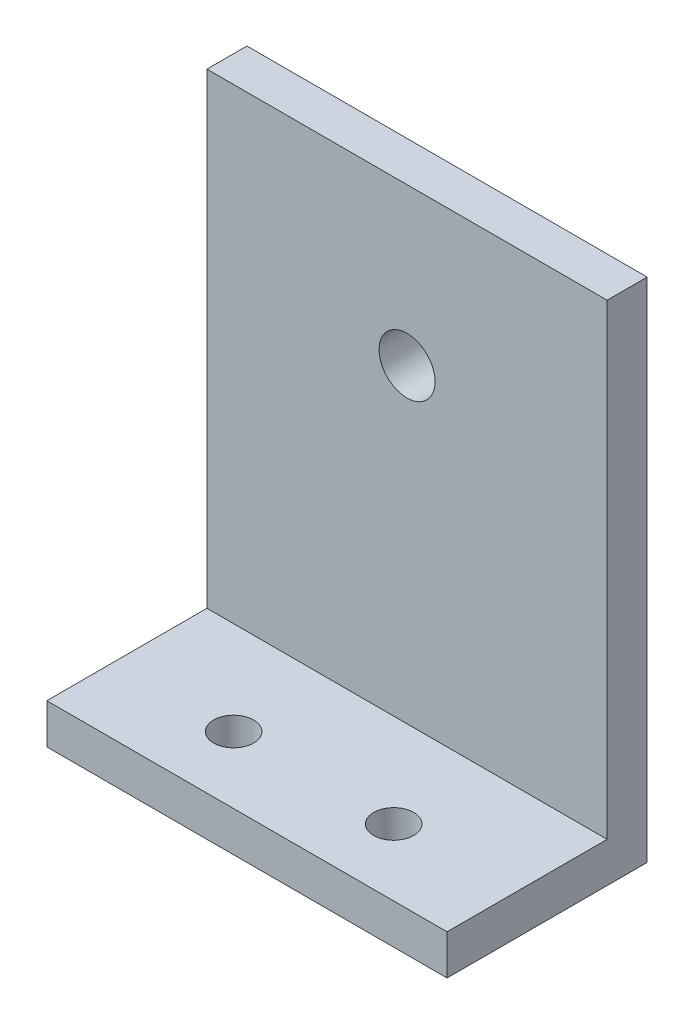
ISO-10303-21;
HEADER;
FILE_DESCRIPTION(('STEP AP214'),'2;1');
FILE_NAME('part.step','',(''),(''),'','','');
FILE_SCHEMA(('AUTOMOTIVE_DESIGN { 1 0 10303 214 1 1 1 1 }'));
ENDSEC;
DATA;
#1=APPLICATION_CONTEXT('core data for automotive mechanical design processes');
#2=APPLICATION_PROTOCOL_DEFINITION('international standard','automotive_design',2000,#1);
#3=PRODUCT_CONTEXT('',#1,'mechanical');
#4=PRODUCT('Part','Part','',(#3));
#5=PRODUCT_RELATED_PRODUCT_CATEGORY('part','',(#4));
#6=PRODUCT_DEFINITION_FORMATION('','',#4);
#7=PRODUCT_DEFINITION_CONTEXT('part definition',#1,'design');
#8=PRODUCT_DEFINITION('design','',#6,#7);
#9=PRODUCT_DEFINITION_SHAPE('','',#8);
#10=(LENGTH_UNIT() NAMED_UNIT(*) SI_UNIT(.MILLI.,.METRE.));
#11=(NAMED_UNIT(*) PLANE_ANGLE_UNIT() SI_UNIT($,.RADIAN.));
#12=(NAMED_UNIT(*) SI_UNIT($,.STERADIAN.) SOLID_ANGLE_UNIT());
#13=UNCERTAINTY_MEASURE_WITH_UNIT(LENGTH_MEASURE(1.E-05),#10,'distance_accuracy_value','');
#14=(GEOMETRIC_REPRESENTATION_CONTEXT(3) GLOBAL_UNCERTAINTY_ASSIGNED_CONTEXT((#13)) GLOBAL_UNIT_ASSIGNED_CONTEXT((#10,
#11,#12)) REPRESENTATION_CONTEXT('',''));
#15=CARTESIAN_POINT('',(0.,0.,0.));
#16=DIRECTION('',(0.,0.,1.));
#17=DIRECTION('',(1.,0.,0.));
#18=AXIS2_PLACEMENT_3D('',#15,#16,#17);
#19=CARTESIAN_POINT('',(30.,0.,0.));
#20=DIRECTION('',(0.,-1.,0.));
#21=DIRECTION('',(0.,0.,-1.));
#22=AXIS2_PLACEMENT_3D('',#19,#20,#21);
#23=PLANE('',#22);
#24=CARTESIAN_POINT('',(8.99999999999999,0.,7.));
#25=DIRECTION('',(0.,1.,0.));
#26=DIRECTION('',(0.,0.,1.));
#27=AXIS2_PLACEMENT_3D('',#24,#25,#26);
#28=CIRCLE('',#27,1.5);
#29=CARTESIAN_POINT('',(8.99999999999999,0.,8.5));
#30=VERTEX_POINT('',#29);
#31=EDGE_CURVE('E146',#30,#30,#28,.T.);
#32=ORIENTED_EDGE('',*,*,#31,.F.);
#33=EDGE_LOOP('',(#32));
#34=FACE_BOUND('',#33,.T.);
#35=CARTESIAN_POINT('',(21.,0.,7.));
#36=DIRECTION('',(0.,1.,0.));
#37=DIRECTION('',(0.,0.,-1.));
#38=AXIS2_PLACEMENT_3D('',#35,#36,#37);
#39=CIRCLE('',#38,1.5);
#40=CARTESIAN_POINT('',(21.,0.,5.5));
#41=VERTEX_POINT('',#40);
#42=EDGE_CURVE('E152',#41,#41,#39,.T.);
#43=ORIENTED_EDGE('',*,*,#42,.F.);
#44=EDGE_LOOP('',(#43));
#45=FACE_BOUND('',#44,.T.);
#46=DIRECTION('',(-1.,0.,0.));
#47=VECTOR('',#46,1.);
#48=CARTESIAN_POINT('',(30.,0.,12.));
#49=LINE('',#48,#47);
#50=CARTESIAN_POINT('',(30.,0.,12.));
#51=VERTEX_POINT('',#50);
#52=CARTESIAN_POINT('',(0.,0.,12.));
#53=VERTEX_POINT('',#52);
#54=EDGE_CURVE('E49',#51,#53,#49,.T.);
#55=ORIENTED_EDGE('',*,*,#54,.F.);
#56=DIRECTION('',(0.,0.,1.));
#57=VECTOR('',#56,1.);
#58=CARTESIAN_POINT('',(30.,0.,0.));
#59=LINE('',#58,#57);
#60=CARTESIAN_POINT('',(30.,0.,0.));
#61=VERTEX_POINT('',#60);
#62=EDGE_CURVE('E122',#61,#51,#59,.T.);
#63=ORIENTED_EDGE('',*,*,#62,.F.);
#64=DIRECTION('',(-1.,0.,0.));
#65=VECTOR('',#64,1.);
#66=CARTESIAN_POINT('',(30.,0.,0.));
#67=LINE('',#66,#65);
#68=CARTESIAN_POINT('',(0.,0.,0.));
#69=VERTEX_POINT('',#68);
#70=EDGE_CURVE('E123',#61,#69,#67,.T.);
#71=ORIENTED_EDGE('',*,*,#70,.T.);
#72=DIRECTION('',(0.,0.,1.));
#73=VECTOR('',#72,1.);
#74=CARTESIAN_POINT('',(0.,0.,0.));
#75=LINE('',#74,#73);
#76=EDGE_CURVE('E112',#69,#53,#75,.T.);
#77=ORIENTED_EDGE('',*,*,#76,.T.);
#78=EDGE_LOOP('',(#55,#63,#71,#77));
#79=FACE_BOUND('',#78,.T.);
#80=ADVANCED_FACE('F35',(#34,#45,#79),#23,.F.);
#81=CARTESIAN_POINT('',(30.,-3.,35.));
#82=DIRECTION('',(0.,1.,0.));
#83=DIRECTION('',(0.,0.,1.));
#84=AXIS2_PLACEMENT_3D('',#81,#82,#83);
#85=PLANE('',#84);
#86=CARTESIAN_POINT('',(8.99999999999999,-3.,7.));
#87=DIRECTION('',(0.,1.,0.));
#88=DIRECTION('',(0.,0.,1.));
#89=AXIS2_PLACEMENT_3D('',#86,#87,#88);
#90=CIRCLE('',#89,1.5);
#91=CARTESIAN_POINT('',(8.99999999999999,-3.,8.5));
#92=VERTEX_POINT('',#91);
#93=EDGE_CURVE('E116',#92,#92,#90,.F.);
#94=ORIENTED_EDGE('',*,*,#93,.F.);
#95=EDGE_LOOP('',(#94));
#96=FACE_BOUND('',#95,.T.);
#97=CARTESIAN_POINT('',(21.,-3.,7.));
#98=DIRECTION('',(0.,1.,0.));
#99=DIRECTION('',(0.,0.,1.));
#100=AXIS2_PLACEMENT_3D('',#97,#98,#99);
#101=CIRCLE('',#100,1.5);
#102=CARTESIAN_POINT('',(21.,-3.,8.5));
#103=VERTEX_POINT('',#102);
#104=EDGE_CURVE('E149',#103,#103,#101,.F.);
#105=ORIENTED_EDGE('',*,*,#104,.F.);
#106=EDGE_LOOP('',(#105));
#107=FACE_BOUND('',#106,.T.);
#108=DIRECTION('',(1.,0.,0.));
#109=VECTOR('',#108,1.);
#110=CARTESIAN_POINT('',(0.,-3.,12.));
#111=LINE('',#110,#109);
#112=CARTESIAN_POINT('',(0.,-3.,12.));
#113=VERTEX_POINT('',#112);
#114=CARTESIAN_POINT('',(30.,-3.,12.));
#115=VERTEX_POINT('',#114);
#116=EDGE_CURVE('E97',#113,#115,#111,.T.);
#117=ORIENTED_EDGE('',*,*,#116,.F.);
#118=DIRECTION('',(0.,0.,-1.));
#119=VECTOR('',#118,1.);
#120=CARTESIAN_POINT('',(0.,-3.,35.));
#121=LINE('',#120,#119);
#122=CARTESIAN_POINT('',(0.,-3.,-3.));
#123=VERTEX_POINT('',#122);
#124=EDGE_CURVE('E105',#113,#123,#121,.T.);
#125=ORIENTED_EDGE('',*,*,#124,.T.);
#126=DIRECTION('',(-1.,0.,0.));
#127=VECTOR('',#126,1.);
#128=CARTESIAN_POINT('',(30.,-3.,-3.));
#129=LINE('',#128,#127);
#130=CARTESIAN_POINT('',(30.,-3.,-3.));
#131=VERTEX_POINT('',#130);
#132=EDGE_CURVE('E11',#131,#123,#129,.T.);
#133=ORIENTED_EDGE('',*,*,#132,.F.);
#134=DIRECTION('',(0.,0.,-1.));
#135=VECTOR('',#134,1.);
#136=CARTESIAN_POINT('',(30.,-3.,35.));
#137=LINE('',#136,#135);
#138=EDGE_CURVE('E86',#115,#131,#137,.T.);
#139=ORIENTED_EDGE('',*,*,#138,.F.);
#140=EDGE_LOOP('',(#117,#125,#133,#139));
#141=FACE_BOUND('',#140,.T.);
#142=ADVANCED_FACE('F104',(#96,#107,#141),#85,.F.);
#143=CARTESIAN_POINT('',(30.,0.,0.));
#144=DIRECTION('',(1.,0.,0.));
#145=DIRECTION('',(0.,0.,-1.));
#146=AXIS2_PLACEMENT_3D('',#143,#144,#145);
#147=PLANE('',#146);
#148=ORIENTED_EDGE('',*,*,#62,.T.);
#149=DIRECTION('',(0.,1.,0.));
#150=VECTOR('',#149,1.);
#151=CARTESIAN_POINT('',(30.,-3.,12.));
#152=LINE('',#151,#150);
#153=EDGE_CURVE('E106',#115,#51,#152,.T.);
#154=ORIENTED_EDGE('',*,*,#153,.F.);
#155=ORIENTED_EDGE('',*,*,#138,.T.);
#156=DIRECTION('',(0.,1.,0.));
#157=VECTOR('',#156,1.);
#158=CARTESIAN_POINT('',(30.,35.,-3.));
#159=LINE('',#158,#157);
#160=CARTESIAN_POINT('',(30.,35.,-3.));
#161=VERTEX_POINT('',#160);
#162=EDGE_CURVE('E138',#131,#161,#159,.T.);
#163=ORIENTED_EDGE('',*,*,#162,.T.);
#164=DIRECTION('',(0.,0.,1.));
#165=VECTOR('',#164,1.);
#166=CARTESIAN_POINT('',(30.,35.,0.));
#167=LINE('',#166,#165);
#168=CARTESIAN_POINT('',(30.,35.,0.));
#169=VERTEX_POINT('',#168);
#170=EDGE_CURVE('E132',#161,#169,#167,.T.);
#171=ORIENTED_EDGE('',*,*,#170,.T.);
#172=DIRECTION('',(0.,-1.,0.));
#173=VECTOR('',#172,1.);
#174=CARTESIAN_POINT('',(30.,0.,0.));
#175=LINE('',#174,#173);
#176=EDGE_CURVE('E58',#169,#61,#175,.T.);
#177=ORIENTED_EDGE('',*,*,#176,.T.);
#178=EDGE_LOOP('',(#148,#154,#155,#163,#171,#177));
#179=FACE_BOUND('',#178,.T.);
#180=ADVANCED_FACE('F162',(#179),#147,.T.);
#181=CARTESIAN_POINT('',(0.,0.,0.));
#182=DIRECTION('',(1.,0.,0.));
#183=DIRECTION('',(0.,0.,-1.));
#184=AXIS2_PLACEMENT_3D('',#181,#182,#183);
#185=PLANE('',#184);
#186=DIRECTION('',(0.,-1.,0.));
#187=VECTOR('',#186,1.);
#188=CARTESIAN_POINT('',(0.,0.,12.));
#189=LINE('',#188,#187);
#190=EDGE_CURVE('E94',#53,#113,#189,.T.);
#191=ORIENTED_EDGE('',*,*,#190,.F.);
#192=ORIENTED_EDGE('',*,*,#76,.F.);
#193=DIRECTION('',(0.,-1.,0.));
#194=VECTOR('',#193,1.);
#195=CARTESIAN_POINT('',(0.,0.,0.));
#196=LINE('',#195,#194);
#197=CARTESIAN_POINT('',(0.,35.,0.));
#198=VERTEX_POINT('',#197);
#199=EDGE_CURVE('E79',#198,#69,#196,.T.);
#200=ORIENTED_EDGE('',*,*,#199,.F.);
#201=DIRECTION('',(0.,0.,1.));
#202=VECTOR('',#201,1.);
#203=CARTESIAN_POINT('',(0.,35.,0.));
#204=LINE('',#203,#202);
#205=CARTESIAN_POINT('',(0.,35.,-3.));
#206=VERTEX_POINT('',#205);
#207=EDGE_CURVE('E114',#206,#198,#204,.T.);
#208=ORIENTED_EDGE('',*,*,#207,.F.);
#209=DIRECTION('',(0.,1.,0.));
#210=VECTOR('',#209,1.);
#211=CARTESIAN_POINT('',(0.,35.,-3.));
#212=LINE('',#211,#210);
#213=EDGE_CURVE('E111',#123,#206,#212,.T.);
#214=ORIENTED_EDGE('',*,*,#213,.F.);
#215=ORIENTED_EDGE('',*,*,#124,.F.);
#216=EDGE_LOOP('',(#191,#192,#200,#208,#214,#215));
#217=FACE_BOUND('',#216,.T.);
#218=ADVANCED_FACE('F109',(#217),#185,.F.);
#219=CARTESIAN_POINT('',(30.,35.,-3.));
#220=DIRECTION('',(0.,0.,1.));
#221=DIRECTION('',(0.,-1.,0.));
#222=AXIS2_PLACEMENT_3D('',#219,#220,#221);
#223=PLANE('',#222);
#224=CARTESIAN_POINT('',(15.,23.25,-3.));
#225=DIRECTION('',(0.,0.,1.));
#226=DIRECTION('',(1.,0.,0.));
#227=AXIS2_PLACEMENT_3D('',#224,#225,#226);
#228=CIRCLE('',#227,2.09999999999998);
#229=CARTESIAN_POINT('',(17.1,23.25,-3.));
#230=VERTEX_POINT('',#229);
#231=EDGE_CURVE('E155',#230,#230,#228,.T.);
#232=ORIENTED_EDGE('',*,*,#231,.T.);
#233=EDGE_LOOP('',(#232));
#234=FACE_BOUND('',#233,.T.);
#235=ORIENTED_EDGE('',*,*,#213,.T.);
#236=DIRECTION('',(-1.,0.,0.));
#237=VECTOR('',#236,1.);
#238=CARTESIAN_POINT('',(30.,35.,-3.));
#239=LINE('',#238,#237);
#240=EDGE_CURVE('E42',#161,#206,#239,.T.);
#241=ORIENTED_EDGE('',*,*,#240,.F.);
#242=ORIENTED_EDGE('',*,*,#162,.F.);
#243=ORIENTED_EDGE('',*,*,#132,.T.);
#244=EDGE_LOOP('',(#235,#241,#242,#243));
#245=FACE_BOUND('',#244,.T.);
#246=ADVANCED_FACE('F169',(#234,#245),#223,.F.);
#247=CARTESIAN_POINT('',(30.,35.,0.));
#248=DIRECTION('',(0.,-1.,0.));
#249=DIRECTION('',(0.,0.,-1.));
#250=AXIS2_PLACEMENT_3D('',#247,#248,#249);
#251=PLANE('',#250);
#252=ORIENTED_EDGE('',*,*,#207,.T.);
#253=DIRECTION('',(-1.,0.,0.));
#254=VECTOR('',#253,1.);
#255=CARTESIAN_POINT('',(30.,35.,0.));
#256=LINE('',#255,#254);
#257=EDGE_CURVE('E125',#169,#198,#256,.T.);
#258=ORIENTED_EDGE('',*,*,#257,.F.);
#259=ORIENTED_EDGE('',*,*,#170,.F.);
#260=ORIENTED_EDGE('',*,*,#240,.T.);
#261=EDGE_LOOP('',(#252,#258,#259,#260));
#262=FACE_BOUND('',#261,.T.);
#263=ADVANCED_FACE('F130',(#262),#251,.F.);
#264=CARTESIAN_POINT('',(30.,0.,0.));
#265=DIRECTION('',(0.,0.,-1.));
#266=DIRECTION('',(-1.,0.,0.));
#267=AXIS2_PLACEMENT_3D('',#264,#265,#266);
#268=PLANE('',#267);
#269=CARTESIAN_POINT('',(15.,23.25,0.));
#270=DIRECTION('',(0.,0.,1.));
#271=DIRECTION('',(1.,0.,0.));
#272=AXIS2_PLACEMENT_3D('',#269,#270,#271);
#273=CIRCLE('',#272,2.09999999999998);
#274=CARTESIAN_POINT('',(17.1,23.25,0.));
#275=VERTEX_POINT('',#274);
#276=EDGE_CURVE('E156',#275,#275,#273,.T.);
#277=ORIENTED_EDGE('',*,*,#276,.F.);
#278=EDGE_LOOP('',(#277));
#279=FACE_BOUND('',#278,.T.);
#280=ORIENTED_EDGE('',*,*,#199,.T.);
#281=ORIENTED_EDGE('',*,*,#70,.F.);
#282=ORIENTED_EDGE('',*,*,#176,.F.);
#283=ORIENTED_EDGE('',*,*,#257,.T.);
#284=EDGE_LOOP('',(#280,#281,#282,#283));
#285=FACE_BOUND('',#284,.T.);
#286=ADVANCED_FACE('F137',(#279,#285),#268,.F.);
#287=CARTESIAN_POINT('',(8.99999999999999,-3.001,7.));
#288=DIRECTION('',(0.,1.,0.));
#289=DIRECTION('',(0.,0.,1.));
#290=AXIS2_PLACEMENT_3D('',#287,#288,#289);
#291=CYLINDRICAL_SURFACE('',#290,1.5);
#292=ORIENTED_EDGE('',*,*,#31,.T.);
#293=EDGE_LOOP('',(#292));
#294=FACE_BOUND('',#293,.T.);
#295=ORIENTED_EDGE('',*,*,#93,.T.);
#296=EDGE_LOOP('',(#295));
#297=FACE_BOUND('',#296,.T.);
#298=ADVANCED_FACE('F185',(#294,#297),#291,.F.);
#299=CARTESIAN_POINT('',(21.,-3.001,7.));
#300=DIRECTION('',(0.,1.,0.));
#301=DIRECTION('',(0.,0.,1.));
#302=AXIS2_PLACEMENT_3D('',#299,#300,#301);
#303=CYLINDRICAL_SURFACE('',#302,1.5);
#304=ORIENTED_EDGE('',*,*,#42,.T.);
#305=EDGE_LOOP('',(#304));
#306=FACE_BOUND('',#305,.T.);
#307=ORIENTED_EDGE('',*,*,#104,.T.);
#308=EDGE_LOOP('',(#307));
#309=FACE_BOUND('',#308,.T.);
#310=ADVANCED_FACE('F181',(#306,#309),#303,.F.);
#311=CARTESIAN_POINT('',(15.,23.25,-3.));
#312=DIRECTION('',(0.,0.,1.));
#313=DIRECTION('',(1.,0.,0.));
#314=AXIS2_PLACEMENT_3D('',#311,#312,#313);
#315=CYLINDRICAL_SURFACE('',#314,2.09999999999998);
#316=ORIENTED_EDGE('',*,*,#231,.F.);
#317=EDGE_LOOP('',(#316));
#318=FACE_BOUND('',#317,.T.);
#319=ORIENTED_EDGE('',*,*,#276,.T.);
#320=EDGE_LOOP('',(#319));
#321=FACE_BOUND('',#320,.T.);
#322=ADVANCED_FACE('F184',(#318,#321),#315,.F.);
#323=CARTESIAN_POINT('',(0.,0.,12.));
#324=DIRECTION('',(0.,0.,1.));
#325=DIRECTION('',(1.,0.,0.));
#326=AXIS2_PLACEMENT_3D('',#323,#324,#325);
#327=PLANE('',#326);
#328=ORIENTED_EDGE('',*,*,#190,.T.);
#329=ORIENTED_EDGE('',*,*,#116,.T.);
#330=ORIENTED_EDGE('',*,*,#153,.T.);
#331=ORIENTED_EDGE('',*,*,#54,.T.);
#332=EDGE_LOOP('',(#328,#329,#330,#331));
#333=FACE_BOUND('',#332,.T.);
#334=ADVANCED_FACE('F96',(#333),#327,.T.);
#335=CLOSED_SHELL('',(#80,#142,#180,#218,#246,#263,#286,#298,#310,#322,#334));
#336=MANIFOLD_SOLID_BREP('B2',#335);
#337=ADVANCED_BREP_SHAPE_REPRESENTATION('',(#18,#336),#14);
#338=SHAPE_DEFINITION_REPRESENTATION(#9,#337);
ENDSEC;
END-ISO-10303-21;
